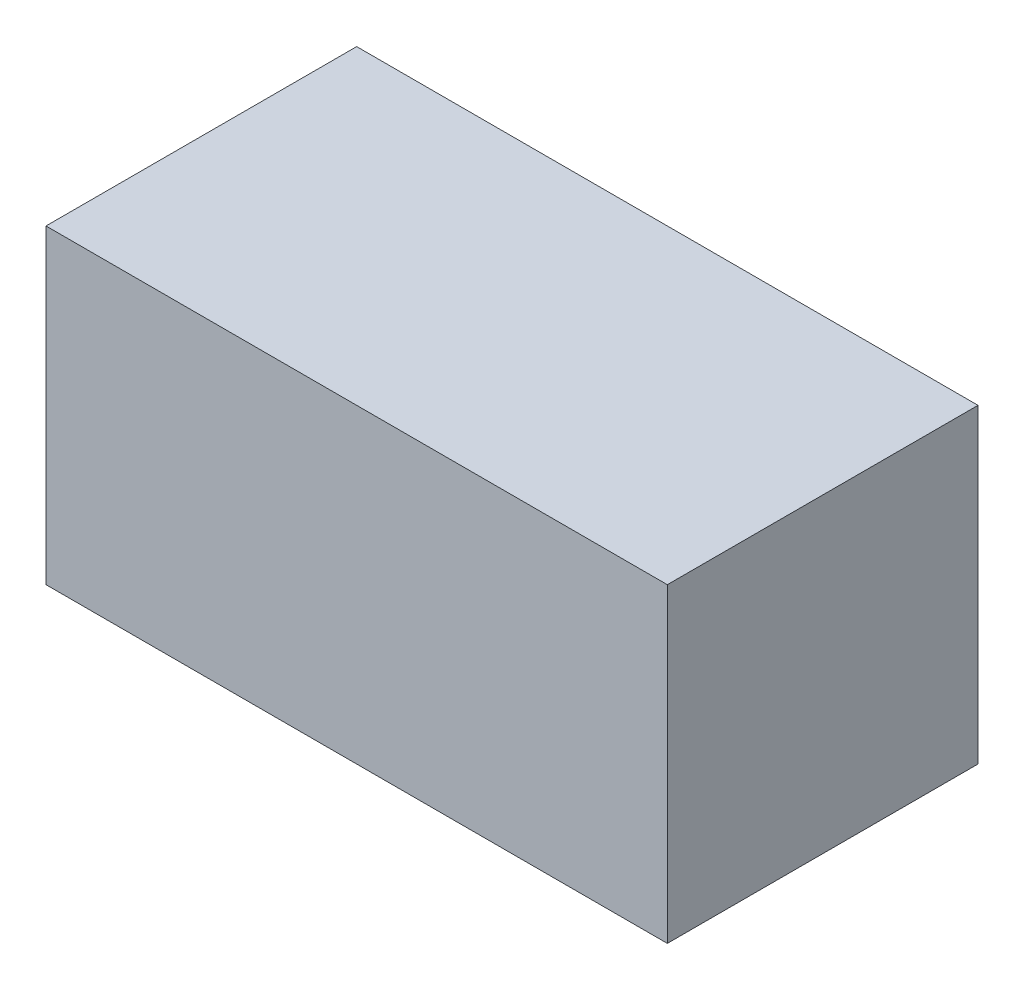
ISO-10303-21;
HEADER;
FILE_DESCRIPTION(('STEP AP214'),'2;1');
FILE_NAME('part.step','',(''),(''),'','','');
FILE_SCHEMA(('AUTOMOTIVE_DESIGN { 1 0 10303 214 1 1 1 1 }'));
ENDSEC;
DATA;
#1=APPLICATION_CONTEXT('core data for automotive mechanical design processes');
#2=APPLICATION_PROTOCOL_DEFINITION('international standard','automotive_design',2000,#1);
#3=PRODUCT_CONTEXT('',#1,'mechanical');
#4=PRODUCT('Part','Part','',(#3));
#5=PRODUCT_RELATED_PRODUCT_CATEGORY('part','',(#4));
#6=PRODUCT_DEFINITION_FORMATION('','',#4);
#7=PRODUCT_DEFINITION_CONTEXT('part definition',#1,'design');
#8=PRODUCT_DEFINITION('design','',#6,#7);
#9=PRODUCT_DEFINITION_SHAPE('','',#8);
#10=(LENGTH_UNIT() NAMED_UNIT(*) SI_UNIT(.MILLI.,.METRE.));
#11=(NAMED_UNIT(*) PLANE_ANGLE_UNIT() SI_UNIT($,.RADIAN.));
#12=(NAMED_UNIT(*) SI_UNIT($,.STERADIAN.) SOLID_ANGLE_UNIT());
#13=UNCERTAINTY_MEASURE_WITH_UNIT(LENGTH_MEASURE(1.E-05),#10,'distance_accuracy_value','');
#14=(GEOMETRIC_REPRESENTATION_CONTEXT(3) GLOBAL_UNCERTAINTY_ASSIGNED_CONTEXT((#13)) GLOBAL_UNIT_ASSIGNED_CONTEXT((#10,
#11,#12)) REPRESENTATION_CONTEXT('',''));
#15=CARTESIAN_POINT('',(0.,0.,0.));
#16=DIRECTION('',(0.,0.,1.));
#17=DIRECTION('',(1.,0.,0.));
#18=AXIS2_PLACEMENT_3D('',#15,#16,#17);
#19=CARTESIAN_POINT('',(-6.35,3.175,12.7));
#20=DIRECTION('',(-1.,0.,0.));
#21=DIRECTION('',(0.,0.,1.));
#22=AXIS2_PLACEMENT_3D('',#19,#20,#21);
#23=PLANE('',#22);
#24=DIRECTION('',(0.,0.,-1.));
#25=VECTOR('',#24,1.);
#26=CARTESIAN_POINT('',(-6.35,3.175,12.7));
#27=LINE('',#26,#25);
#28=CARTESIAN_POINT('',(-6.35,3.175,6.35));
#29=VERTEX_POINT('',#28);
#30=CARTESIAN_POINT('',(-6.35,3.175,0.));
#31=VERTEX_POINT('',#30);
#32=EDGE_CURVE('E68',#29,#31,#27,.T.);
#33=ORIENTED_EDGE('',*,*,#32,.F.);
#34=DIRECTION('',(0.,1.,0.));
#35=VECTOR('',#34,1.);
#36=CARTESIAN_POINT('',(-6.35,3.175,6.35));
#37=LINE('',#36,#35);
#38=CARTESIAN_POINT('',(-6.35,9.525,6.35));
#39=VERTEX_POINT('',#38);
#40=EDGE_CURVE('E61',#29,#39,#37,.T.);
#41=ORIENTED_EDGE('',*,*,#40,.T.);
#42=DIRECTION('',(0.,0.,-1.));
#43=VECTOR('',#42,1.);
#44=CARTESIAN_POINT('',(-6.35,9.525,12.7));
#45=LINE('',#44,#43);
#46=CARTESIAN_POINT('',(-6.35,9.525,0.));
#47=VERTEX_POINT('',#46);
#48=EDGE_CURVE('E120',#39,#47,#45,.T.);
#49=ORIENTED_EDGE('',*,*,#48,.T.);
#50=DIRECTION('',(0.,1.,0.));
#51=VECTOR('',#50,1.);
#52=CARTESIAN_POINT('',(-6.35,3.175,0.));
#53=LINE('',#52,#51);
#54=EDGE_CURVE('E234',#31,#47,#53,.T.);
#55=ORIENTED_EDGE('',*,*,#54,.F.);
#56=EDGE_LOOP('',(#33,#41,#49,#55));
#57=FACE_BOUND('',#56,.T.);
#58=ADVANCED_FACE('F45',(#57),#23,.T.);
#59=CARTESIAN_POINT('',(-6.35,9.525,12.7));
#60=DIRECTION('',(0.,-1.,0.));
#61=DIRECTION('',(0.,0.,-1.));
#62=AXIS2_PLACEMENT_3D('',#59,#60,#61);
#63=PLANE('',#62);
#64=ORIENTED_EDGE('',*,*,#48,.F.);
#65=DIRECTION('',(-1.,0.,0.));
#66=VECTOR('',#65,1.);
#67=CARTESIAN_POINT('',(-6.35,9.525,6.35));
#68=LINE('',#67,#66);
#69=CARTESIAN_POINT('',(-19.05,9.525,6.35));
#70=VERTEX_POINT('',#69);
#71=EDGE_CURVE('E110',#39,#70,#68,.T.);
#72=ORIENTED_EDGE('',*,*,#71,.T.);
#73=DIRECTION('',(0.,0.,-1.));
#74=VECTOR('',#73,1.);
#75=CARTESIAN_POINT('',(-19.05,9.525,12.7));
#76=LINE('',#75,#74);
#77=CARTESIAN_POINT('',(-19.05,9.525,0.));
#78=VERTEX_POINT('',#77);
#79=EDGE_CURVE('E130',#70,#78,#76,.T.);
#80=ORIENTED_EDGE('',*,*,#79,.T.);
#81=DIRECTION('',(-1.,0.,0.));
#82=VECTOR('',#81,1.);
#83=CARTESIAN_POINT('',(-6.35,9.525,0.));
#84=LINE('',#83,#82);
#85=EDGE_CURVE('E126',#47,#78,#84,.T.);
#86=ORIENTED_EDGE('',*,*,#85,.F.);
#87=EDGE_LOOP('',(#64,#72,#80,#86));
#88=FACE_BOUND('',#87,.T.);
#89=ADVANCED_FACE('F124',(#88),#63,.T.);
#90=CARTESIAN_POINT('',(-19.05,3.175,12.7));
#91=DIRECTION('',(1.,0.,0.));
#92=DIRECTION('',(0.,0.,-1.));
#93=AXIS2_PLACEMENT_3D('',#90,#91,#92);
#94=PLANE('',#93);
#95=ORIENTED_EDGE('',*,*,#79,.F.);
#96=DIRECTION('',(0.,-1.,0.));
#97=VECTOR('',#96,1.);
#98=CARTESIAN_POINT('',(-19.05,3.175,6.35));
#99=LINE('',#98,#97);
#100=CARTESIAN_POINT('',(-19.05,3.175,6.35));
#101=VERTEX_POINT('',#100);
#102=EDGE_CURVE('E113',#70,#101,#99,.T.);
#103=ORIENTED_EDGE('',*,*,#102,.T.);
#104=DIRECTION('',(0.,0.,-1.));
#105=VECTOR('',#104,1.);
#106=CARTESIAN_POINT('',(-19.05,3.175,12.7));
#107=LINE('',#106,#105);
#108=CARTESIAN_POINT('',(-19.05,3.175,0.));
#109=VERTEX_POINT('',#108);
#110=EDGE_CURVE('E137',#101,#109,#107,.T.);
#111=ORIENTED_EDGE('',*,*,#110,.T.);
#112=DIRECTION('',(0.,-1.,0.));
#113=VECTOR('',#112,1.);
#114=CARTESIAN_POINT('',(-19.05,3.175,0.));
#115=LINE('',#114,#113);
#116=EDGE_CURVE('E229',#78,#109,#115,.T.);
#117=ORIENTED_EDGE('',*,*,#116,.F.);
#118=EDGE_LOOP('',(#95,#103,#111,#117));
#119=FACE_BOUND('',#118,.T.);
#120=ADVANCED_FACE('F205',(#119),#94,.T.);
#121=CARTESIAN_POINT('',(-6.35,3.175,12.7));
#122=DIRECTION('',(0.,1.,0.));
#123=DIRECTION('',(0.,0.,1.));
#124=AXIS2_PLACEMENT_3D('',#121,#122,#123);
#125=PLANE('',#124);
#126=ORIENTED_EDGE('',*,*,#110,.F.);
#127=DIRECTION('',(1.,0.,0.));
#128=VECTOR('',#127,1.);
#129=CARTESIAN_POINT('',(-6.35,3.175,6.35));
#130=LINE('',#129,#128);
#131=EDGE_CURVE('E238',#101,#29,#130,.T.);
#132=ORIENTED_EDGE('',*,*,#131,.T.);
#133=ORIENTED_EDGE('',*,*,#32,.T.);
#134=DIRECTION('',(1.,0.,0.));
#135=VECTOR('',#134,1.);
#136=CARTESIAN_POINT('',(-6.35,3.175,0.));
#137=LINE('',#136,#135);
#138=EDGE_CURVE('E232',#109,#31,#137,.T.);
#139=ORIENTED_EDGE('',*,*,#138,.F.);
#140=EDGE_LOOP('',(#126,#132,#133,#139));
#141=FACE_BOUND('',#140,.T.);
#142=ADVANCED_FACE('F211',(#141),#125,.T.);
#143=CARTESIAN_POINT('',(0.,0.,12.7));
#144=DIRECTION('',(0.,0.,1.));
#145=DIRECTION('',(1.,0.,0.));
#146=AXIS2_PLACEMENT_3D('',#143,#144,#145);
#147=PLANE('',#146);
#148=DIRECTION('',(0.,1.,0.));
#149=VECTOR('',#148,1.);
#150=CARTESIAN_POINT('',(0.,0.,12.7));
#151=LINE('',#150,#149);
#152=CARTESIAN_POINT('',(0.,0.,12.7));
#153=VERTEX_POINT('',#152);
#154=CARTESIAN_POINT('',(0.,12.7,12.7));
#155=VERTEX_POINT('',#154);
#156=EDGE_CURVE('E141',#153,#155,#151,.T.);
#157=ORIENTED_EDGE('',*,*,#156,.T.);
#158=DIRECTION('',(-1.,0.,0.));
#159=VECTOR('',#158,1.);
#160=CARTESIAN_POINT('',(0.,12.7,12.7));
#161=LINE('',#160,#159);
#162=CARTESIAN_POINT('',(-25.4,12.7,12.7));
#163=VERTEX_POINT('',#162);
#164=EDGE_CURVE('E145',#155,#163,#161,.T.);
#165=ORIENTED_EDGE('',*,*,#164,.T.);
#166=DIRECTION('',(0.,-1.,0.));
#167=VECTOR('',#166,1.);
#168=CARTESIAN_POINT('',(-25.4,0.,12.7));
#169=LINE('',#168,#167);
#170=CARTESIAN_POINT('',(-25.4,0.,12.7));
#171=VERTEX_POINT('',#170);
#172=EDGE_CURVE('E149',#163,#171,#169,.T.);
#173=ORIENTED_EDGE('',*,*,#172,.T.);
#174=DIRECTION('',(1.,0.,0.));
#175=VECTOR('',#174,1.);
#176=CARTESIAN_POINT('',(0.,0.,12.7));
#177=LINE('',#176,#175);
#178=EDGE_CURVE('E152',#171,#153,#177,.T.);
#179=ORIENTED_EDGE('',*,*,#178,.T.);
#180=EDGE_LOOP('',(#157,#165,#173,#179));
#181=FACE_BOUND('',#180,.T.);
#182=ADVANCED_FACE('F191',(#181),#147,.T.);
#183=CARTESIAN_POINT('',(0.,0.,0.));
#184=DIRECTION('',(0.,0.,1.));
#185=DIRECTION('',(1.,0.,0.));
#186=AXIS2_PLACEMENT_3D('',#183,#184,#185);
#187=PLANE('',#186);
#188=DIRECTION('',(0.,1.,0.));
#189=VECTOR('',#188,1.);
#190=CARTESIAN_POINT('',(0.,0.,0.));
#191=LINE('',#190,#189);
#192=CARTESIAN_POINT('',(0.,0.,0.));
#193=VERTEX_POINT('',#192);
#194=CARTESIAN_POINT('',(0.,12.7,0.));
#195=VERTEX_POINT('',#194);
#196=EDGE_CURVE('E129',#193,#195,#191,.T.);
#197=ORIENTED_EDGE('',*,*,#196,.F.);
#198=DIRECTION('',(1.,0.,0.));
#199=VECTOR('',#198,1.);
#200=CARTESIAN_POINT('',(0.,0.,0.));
#201=LINE('',#200,#199);
#202=CARTESIAN_POINT('',(-25.4,0.,0.));
#203=VERTEX_POINT('',#202);
#204=EDGE_CURVE('E146',#203,#193,#201,.T.);
#205=ORIENTED_EDGE('',*,*,#204,.F.);
#206=DIRECTION('',(0.,-1.,0.));
#207=VECTOR('',#206,1.);
#208=CARTESIAN_POINT('',(-25.4,0.,0.));
#209=LINE('',#208,#207);
#210=CARTESIAN_POINT('',(-25.4,12.7,0.));
#211=VERTEX_POINT('',#210);
#212=EDGE_CURVE('E158',#211,#203,#209,.T.);
#213=ORIENTED_EDGE('',*,*,#212,.F.);
#214=DIRECTION('',(-1.,0.,0.));
#215=VECTOR('',#214,1.);
#216=CARTESIAN_POINT('',(0.,12.7,0.));
#217=LINE('',#216,#215);
#218=EDGE_CURVE('E135',#195,#211,#217,.T.);
#219=ORIENTED_EDGE('',*,*,#218,.F.);
#220=EDGE_LOOP('',(#197,#205,#213,#219));
#221=FACE_BOUND('',#220,.T.);
#222=ORIENTED_EDGE('',*,*,#54,.T.);
#223=ORIENTED_EDGE('',*,*,#85,.T.);
#224=ORIENTED_EDGE('',*,*,#116,.T.);
#225=ORIENTED_EDGE('',*,*,#138,.T.);
#226=EDGE_LOOP('',(#222,#223,#224,#225));
#227=FACE_BOUND('',#226,.T.);
#228=ADVANCED_FACE('F181',(#221,#227),#187,.F.);
#229=CARTESIAN_POINT('',(0.,0.,12.7));
#230=DIRECTION('',(-1.,0.,0.));
#231=DIRECTION('',(0.,0.,1.));
#232=AXIS2_PLACEMENT_3D('',#229,#230,#231);
#233=PLANE('',#232);
#234=ORIENTED_EDGE('',*,*,#196,.T.);
#235=DIRECTION('',(0.,0.,-1.));
#236=VECTOR('',#235,1.);
#237=CARTESIAN_POINT('',(0.,12.7,12.7));
#238=LINE('',#237,#236);
#239=EDGE_CURVE('E11',#155,#195,#238,.T.);
#240=ORIENTED_EDGE('',*,*,#239,.F.);
#241=ORIENTED_EDGE('',*,*,#156,.F.);
#242=DIRECTION('',(0.,0.,-1.));
#243=VECTOR('',#242,1.);
#244=CARTESIAN_POINT('',(0.,0.,12.7));
#245=LINE('',#244,#243);
#246=EDGE_CURVE('E154',#153,#193,#245,.T.);
#247=ORIENTED_EDGE('',*,*,#246,.T.);
#248=EDGE_LOOP('',(#234,#240,#241,#247));
#249=FACE_BOUND('',#248,.T.);
#250=ADVANCED_FACE('F47',(#249),#233,.F.);
#251=CARTESIAN_POINT('',(0.,12.7,12.7));
#252=DIRECTION('',(0.,-1.,0.));
#253=DIRECTION('',(1.,0.,0.));
#254=AXIS2_PLACEMENT_3D('',#251,#252,#253);
#255=PLANE('',#254);
#256=ORIENTED_EDGE('',*,*,#218,.T.);
#257=DIRECTION('',(0.,0.,-1.));
#258=VECTOR('',#257,1.);
#259=CARTESIAN_POINT('',(-25.4,12.7,12.7));
#260=LINE('',#259,#258);
#261=EDGE_CURVE('E54',#163,#211,#260,.T.);
#262=ORIENTED_EDGE('',*,*,#261,.F.);
#263=ORIENTED_EDGE('',*,*,#164,.F.);
#264=ORIENTED_EDGE('',*,*,#239,.T.);
#265=EDGE_LOOP('',(#256,#262,#263,#264));
#266=FACE_BOUND('',#265,.T.);
#267=ADVANCED_FACE('F192',(#266),#255,.F.);
#268=CARTESIAN_POINT('',(-25.4,0.,12.7));
#269=DIRECTION('',(1.,0.,0.));
#270=DIRECTION('',(0.,0.,-1.));
#271=AXIS2_PLACEMENT_3D('',#268,#269,#270);
#272=PLANE('',#271);
#273=ORIENTED_EDGE('',*,*,#212,.T.);
#274=DIRECTION('',(0.,0.,-1.));
#275=VECTOR('',#274,1.);
#276=CARTESIAN_POINT('',(-25.4,0.,12.7));
#277=LINE('',#276,#275);
#278=EDGE_CURVE('E166',#171,#203,#277,.T.);
#279=ORIENTED_EDGE('',*,*,#278,.F.);
#280=ORIENTED_EDGE('',*,*,#172,.F.);
#281=ORIENTED_EDGE('',*,*,#261,.T.);
#282=EDGE_LOOP('',(#273,#279,#280,#281));
#283=FACE_BOUND('',#282,.T.);
#284=ADVANCED_FACE('F175',(#283),#272,.F.);
#285=CARTESIAN_POINT('',(0.,0.,12.7));
#286=DIRECTION('',(0.,1.,0.));
#287=DIRECTION('',(0.,0.,1.));
#288=AXIS2_PLACEMENT_3D('',#285,#286,#287);
#289=PLANE('',#288);
#290=ORIENTED_EDGE('',*,*,#204,.T.);
#291=ORIENTED_EDGE('',*,*,#246,.F.);
#292=ORIENTED_EDGE('',*,*,#178,.F.);
#293=ORIENTED_EDGE('',*,*,#278,.T.);
#294=EDGE_LOOP('',(#290,#291,#292,#293));
#295=FACE_BOUND('',#294,.T.);
#296=ADVANCED_FACE('F185',(#295),#289,.F.);
#297=CARTESIAN_POINT('',(0.,0.,6.35));
#298=DIRECTION('',(0.,0.,1.));
#299=DIRECTION('',(1.,0.,0.));
#300=AXIS2_PLACEMENT_3D('',#297,#298,#299);
#301=PLANE('',#300);
#302=ORIENTED_EDGE('',*,*,#40,.F.);
#303=ORIENTED_EDGE('',*,*,#131,.F.);
#304=ORIENTED_EDGE('',*,*,#102,.F.);
#305=ORIENTED_EDGE('',*,*,#71,.F.);
#306=EDGE_LOOP('',(#302,#303,#304,#305));
#307=FACE_BOUND('',#306,.T.);
#308=ADVANCED_FACE('F111',(#307),#301,.F.);
#309=CLOSED_SHELL('',(#58,#89,#120,#142,#182,#228,#250,#267,#284,#296,#308));
#310=MANIFOLD_SOLID_BREP('B2',#309);
#311=ADVANCED_BREP_SHAPE_REPRESENTATION('',(#18,#310),#14);
#312=SHAPE_DEFINITION_REPRESENTATION(#9,#311);
ENDSEC;
END-ISO-10303-21;
